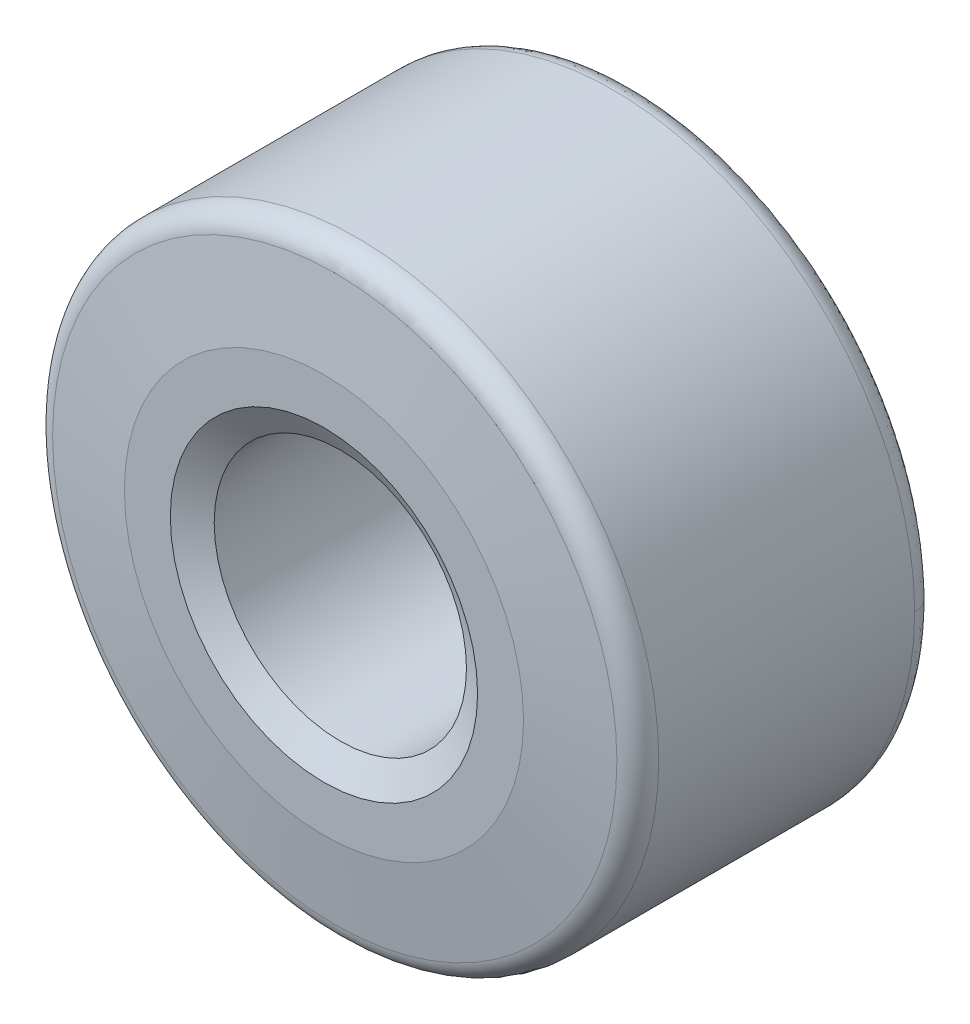
ISO-10303-21;
HEADER;
FILE_DESCRIPTION(('STEP AP214'),'2;1');
FILE_NAME('part.step','',(''),(''),'','','');
FILE_SCHEMA(('AUTOMOTIVE_DESIGN { 1 0 10303 214 1 1 1 1 }'));
ENDSEC;
DATA;
#1=APPLICATION_CONTEXT('core data for automotive mechanical design processes');
#2=APPLICATION_PROTOCOL_DEFINITION('international standard','automotive_design',2000,#1);
#3=PRODUCT_CONTEXT('',#1,'mechanical');
#4=PRODUCT('Part','Part','',(#3));
#5=PRODUCT_RELATED_PRODUCT_CATEGORY('part','',(#4));
#6=PRODUCT_DEFINITION_FORMATION('','',#4);
#7=PRODUCT_DEFINITION_CONTEXT('part definition',#1,'design');
#8=PRODUCT_DEFINITION('design','',#6,#7);
#9=PRODUCT_DEFINITION_SHAPE('','',#8);
#10=(LENGTH_UNIT() NAMED_UNIT(*) SI_UNIT(.MILLI.,.METRE.));
#11=(NAMED_UNIT(*) PLANE_ANGLE_UNIT() SI_UNIT($,.RADIAN.));
#12=(NAMED_UNIT(*) SI_UNIT($,.STERADIAN.) SOLID_ANGLE_UNIT());
#13=UNCERTAINTY_MEASURE_WITH_UNIT(LENGTH_MEASURE(1.E-05),#10,'distance_accuracy_value','');
#14=(GEOMETRIC_REPRESENTATION_CONTEXT(3) GLOBAL_UNCERTAINTY_ASSIGNED_CONTEXT((#13)) GLOBAL_UNIT_ASSIGNED_CONTEXT((#10,
#11,#12)) REPRESENTATION_CONTEXT('',''));
#15=CARTESIAN_POINT('',(0.,0.,0.));
#16=DIRECTION('',(0.,0.,1.));
#17=DIRECTION('',(1.,0.,0.));
#18=AXIS2_PLACEMENT_3D('',#15,#16,#17);
#19=CARTESIAN_POINT('',(117.,71.720826819,276.217998748));
#20=DIRECTION('',(0.,0.,-1.));
#21=DIRECTION('',(-1.,0.,0.));
#22=AXIS2_PLACEMENT_3D('',#19,#20,#21);
#23=CONICAL_SURFACE('',#22,28.07179677,1.05666839407383);
#24=CARTESIAN_POINT('',(117.,71.720826819,276.217998748));
#25=DIRECTION('',(0.,0.,-1.));
#26=DIRECTION('',(-1.,0.,0.));
#27=AXIS2_PLACEMENT_3D('',#24,#25,#26);
#28=CIRCLE('',#27,28.07179677);
#29=CARTESIAN_POINT('',(88.92820323,71.720826819,276.217998748));
#30=VERTEX_POINT('',#29);
#31=EDGE_CURVE('E73',#30,#30,#28,.T.);
#32=ORIENTED_EDGE('',*,*,#31,.F.);
#33=EDGE_LOOP('',(#32));
#34=FACE_BOUND('',#33,.T.);
#35=CARTESIAN_POINT('',(117.,71.720826819,272.757789575));
#36=DIRECTION('',(0.,0.,-1.));
#37=DIRECTION('',(-1.,0.,0.));
#38=AXIS2_PLACEMENT_3D('',#35,#36,#37);
#39=CIRCLE('',#38,34.1983294710002);
#40=CARTESIAN_POINT('',(82.8016705289998,71.720826819,272.757789575));
#41=VERTEX_POINT('',#40);
#42=EDGE_CURVE('E21',#41,#41,#39,.F.);
#43=ORIENTED_EDGE('',*,*,#42,.F.);
#44=EDGE_LOOP('',(#43));
#45=FACE_BOUND('',#44,.T.);
#46=ADVANCED_FACE('F17',(#34,#45),#23,.F.);
#47=CARTESIAN_POINT('',(161.949663623,26.771163195,272.757789575));
#48=DIRECTION('',(0.,0.,-1.));
#49=DIRECTION('',(-1.,0.,0.));
#50=AXIS2_PLACEMENT_3D('',#47,#48,#49);
#51=PLANE('',#50);
#52=ORIENTED_EDGE('',*,*,#42,.T.);
#53=EDGE_LOOP('',(#52));
#54=FACE_BOUND('',#53,.T.);
#55=CARTESIAN_POINT('',(117.,71.720826819,272.757789575));
#56=DIRECTION('',(0.,0.,1.));
#57=DIRECTION('',(1.,0.,0.));
#58=AXIS2_PLACEMENT_3D('',#55,#56,#57);
#59=CIRCLE('',#58,44.4166636589994);
#60=CARTESIAN_POINT('',(161.416663658999,71.720826819,272.757789575));
#61=VERTEX_POINT('',#60);
#62=EDGE_CURVE('E79',#61,#61,#59,.F.);
#63=ORIENTED_EDGE('',*,*,#62,.T.);
#64=EDGE_LOOP('',(#63));
#65=FACE_BOUND('',#64,.T.);
#66=ADVANCED_FACE('F191',(#54,#65),#51,.T.);
#67=CARTESIAN_POINT('',(117.,71.720826819,341.126186813));
#68=DIRECTION('',(0.,0.,-1.));
#69=DIRECTION('',(-1.,0.,0.));
#70=AXIS2_PLACEMENT_3D('',#67,#68,#69);
#71=CYLINDRICAL_SURFACE('',#70,28.07179677);
#72=CARTESIAN_POINT('',(117.,71.720826819,341.126186813));
#73=DIRECTION('',(0.,0.,1.));
#74=DIRECTION('',(1.,0.,0.));
#75=AXIS2_PLACEMENT_3D('',#72,#73,#74);
#76=CIRCLE('',#75,28.07179677);
#77=CARTESIAN_POINT('',(145.07179677,71.720826819,341.126186813));
#78=VERTEX_POINT('',#77);
#79=EDGE_CURVE('E54',#78,#78,#76,.F.);
#80=ORIENTED_EDGE('',*,*,#79,.F.);
#81=EDGE_LOOP('',(#80));
#82=FACE_BOUND('',#81,.T.);
#83=ORIENTED_EDGE('',*,*,#31,.T.);
#84=EDGE_LOOP('',(#83));
#85=FACE_BOUND('',#84,.T.);
#86=ADVANCED_FACE('F182',(#82,#85),#71,.F.);
#87=CARTESIAN_POINT('',(117.,71.720826819,272.757789575));
#88=DIRECTION('',(0.,0.,1.));
#89=DIRECTION('',(1.,0.,0.));
#90=AXIS2_PLACEMENT_3D('',#87,#88,#89);
#91=CONICAL_SURFACE('',#90,44.416663659,1.4229309625579);
#92=CARTESIAN_POINT('',(117.,71.720826819,275.507961254697));
#93=DIRECTION('',(0.,0.,1.));
#94=DIRECTION('',(1.,0.,0.));
#95=AXIS2_PLACEMENT_3D('',#92,#93,#94);
#96=CIRCLE('',#95,62.8800747072118);
#97=CARTESIAN_POINT('',(179.880074706411,71.7208268152358,275.507961254505));
#98=VERTEX_POINT('',#97);
#99=CARTESIAN_POINT('',(54.1199252951898,71.7208267932061,275.507961254121));
#100=VERTEX_POINT('',#99);
#101=EDGE_CURVE('E46',#98,#100,#96,.T.);
#102=ORIENTED_EDGE('',*,*,#101,.F.);
#103=CARTESIAN_POINT('',(117.,71.720826819,275.507961254697));
#104=DIRECTION('',(0.,0.,1.));
#105=DIRECTION('',(1.,0.,0.));
#106=AXIS2_PLACEMENT_3D('',#103,#104,#105);
#107=CIRCLE('',#106,62.8800747072118);
#108=EDGE_CURVE('E43',#100,#98,#107,.T.);
#109=ORIENTED_EDGE('',*,*,#108,.F.);
#110=EDGE_LOOP('',(#102,#109));
#111=FACE_BOUND('',#110,.T.);
#112=ORIENTED_EDGE('',*,*,#62,.F.);
#113=EDGE_LOOP('',(#112));
#114=FACE_BOUND('',#113,.T.);
#115=ADVANCED_FACE('F47',(#111,#114),#91,.T.);
#116=CARTESIAN_POINT('',(117.,71.720826819,341.126186813));
#117=DIRECTION('',(0.,0.,1.));
#118=DIRECTION('',(1.,0.,0.));
#119=AXIS2_PLACEMENT_3D('',#116,#117,#118);
#120=CONICAL_SURFACE('',#119,28.07179677,1.03390574508139);
#121=ORIENTED_EDGE('',*,*,#79,.T.);
#122=EDGE_LOOP('',(#121));
#123=FACE_BOUND('',#122,.T.);
#124=CARTESIAN_POINT('',(117.,71.720826819,344.77276519));
#125=DIRECTION('',(0.,0.,1.));
#126=DIRECTION('',(1.,0.,0.));
#127=AXIS2_PLACEMENT_3D('',#124,#125,#126);
#128=CIRCLE('',#127,34.1983294710001);
#129=CARTESIAN_POINT('',(151.198329471,71.720826819,344.77276519));
#130=VERTEX_POINT('',#129);
#131=EDGE_CURVE('E60',#130,#130,#128,.F.);
#132=ORIENTED_EDGE('',*,*,#131,.F.);
#133=EDGE_LOOP('',(#132));
#134=FACE_BOUND('',#133,.T.);
#135=ADVANCED_FACE('F165',(#123,#134),#120,.F.);
#136=CARTESIAN_POINT('',(49.881540108,71.720826819,280.952567442));
#137=CARTESIAN_POINT('',(49.881540108,-62.516092966,280.952567442));
#138=CARTESIAN_POINT('',(184.118459892,-62.516092966,280.952567442));
#139=CARTESIAN_POINT('',(184.118459892,71.720826819,280.952567442));
#140=CARTESIAN_POINT('',(49.576900876,71.720826819,277.916336547));
#141=CARTESIAN_POINT('',(49.576900876,-63.125371429,277.916336547));
#142=CARTESIAN_POINT('',(184.423099124,-63.125371429,277.916336547));
#143=CARTESIAN_POINT('',(184.423099124,71.720826819,277.916336547));
#144=CARTESIAN_POINT('',(51.569344866,71.720826819,275.605131221));
#145=CARTESIAN_POINT('',(51.569344866,-59.140483449,275.605131221));
#146=CARTESIAN_POINT('',(182.430655134,-59.140483449,275.605131221));
#147=CARTESIAN_POINT('',(182.430655134,71.720826819,275.605131221));
#148=CARTESIAN_POINT('',(54.617325489,71.720826819,275.459126998));
#149=CARTESIAN_POINT('',(54.617325489,-53.044522203,275.459126998));
#150=CARTESIAN_POINT('',(179.382674511,-53.044522203,275.459126998));
#151=CARTESIAN_POINT('',(179.382674511,71.720826819,275.459126998));
#152=(BOUNDED_SURFACE() B_SPLINE_SURFACE(3,3,((#136,#137,#138,#139),(#140,#141,#142,#143),(#144,
#145,#146,#147),(#148,#149,#150,#151)),.UNSPECIFIED.,.F.,.F.,
.F.) B_SPLINE_SURFACE_WITH_KNOTS((4,4),(4,4),(0.,1.),(0.,1.),
.UNSPECIFIED.) GEOMETRIC_REPRESENTATION_ITEM() RATIONAL_B_SPLINE_SURFACE(((1.,0.333333333333333,
0.333333333333333,1.),(0.792290842430709,0.264096947476903,0.264096947476903,0.792290842430709),
(0.792290842430709,0.264096947476903,0.264096947476903,0.792290842430709),(1.,0.333333333333333,
0.333333333333333,1.))) REPRESENTATION_ITEM('') SURFACE());
#153=CARTESIAN_POINT('',(184.118459892,71.720826819,280.952567442));
#154=CARTESIAN_POINT('',(184.423099124,71.720826819,277.916336547));
#155=CARTESIAN_POINT('',(182.430655134,71.720826819,275.605131221));
#156=CARTESIAN_POINT('',(179.382674511,71.720826819,275.459126998));
#157=(BOUNDED_CURVE() B_SPLINE_CURVE(3,(#153,#154,#155,#156),.UNSPECIFIED.,.F.,
.F.) B_SPLINE_CURVE_WITH_KNOTS((4,4),(0.,1.),
.UNSPECIFIED.) CURVE() GEOMETRIC_REPRESENTATION_ITEM() RATIONAL_B_SPLINE_CURVE((1.,
0.792290842430708,0.792290842430708,1.)) REPRESENTATION_ITEM(''));
#158=CARTESIAN_POINT('',(184.143439065793,71.7208268121143,280.453400356077));
#159=VERTEX_POINT('',#158);
#160=EDGE_CURVE('E36',#159,#98,#157,.T.);
#161=CARTESIAN_POINT('',(117.,71.720826819,280.453400359));
#162=DIRECTION('',(0.,0.,-1.));
#163=DIRECTION('',(-1.,0.,0.));
#164=AXIS2_PLACEMENT_3D('',#161,#162,#163);
#165=CIRCLE('',#164,67.143439066);
#166=CARTESIAN_POINT('',(49.8565609341726,71.7208268159855,280.453400356564));
#167=VERTEX_POINT('',#166);
#168=EDGE_CURVE('E63',#159,#167,#165,.T.);
#169=CARTESIAN_POINT('',(49.881540108,71.720826819,280.952567442));
#170=CARTESIAN_POINT('',(49.576900876,71.720826819,277.916336547));
#171=CARTESIAN_POINT('',(51.569344866,71.720826819,275.605131221));
#172=CARTESIAN_POINT('',(54.617325489,71.720826819,275.459126998));
#173=(BOUNDED_CURVE() B_SPLINE_CURVE(3,(#169,#170,#171,#172),.UNSPECIFIED.,.F.,
.F.) B_SPLINE_CURVE_WITH_KNOTS((4,4),(0.,1.),
.UNSPECIFIED.) CURVE() GEOMETRIC_REPRESENTATION_ITEM() RATIONAL_B_SPLINE_CURVE((1.,
0.792290842430708,0.792290842430708,1.)) REPRESENTATION_ITEM(''));
#174=EDGE_CURVE('E51',#100,#167,#173,.F.);
#175=ORIENTED_EDGE('',*,*,#160,.F.);
#176=ORIENTED_EDGE('',*,*,#168,.T.);
#177=ORIENTED_EDGE('',*,*,#174,.F.);
#178=ORIENTED_EDGE('',*,*,#108,.T.);
#179=EDGE_LOOP('',(#175,#176,#177,#178));
#180=FACE_BOUND('',#179,.T.);
#181=ADVANCED_FACE('F53',(#180),#152,.T.);
#182=CARTESIAN_POINT('',(184.118459892,71.720826819,280.952567442));
#183=CARTESIAN_POINT('',(184.118459892,205.957746603,280.952567442));
#184=CARTESIAN_POINT('',(49.881540108,205.957746603,280.952567442));
#185=CARTESIAN_POINT('',(49.881540108,71.720826819,280.952567442));
#186=CARTESIAN_POINT('',(184.423099124,71.720826819,277.916336547));
#187=CARTESIAN_POINT('',(184.423099124,206.567025066,277.916336547));
#188=CARTESIAN_POINT('',(49.576900876,206.567025066,277.916336547));
#189=CARTESIAN_POINT('',(49.576900876,71.720826819,277.916336547));
#190=CARTESIAN_POINT('',(182.430655134,71.720826819,275.605131221));
#191=CARTESIAN_POINT('',(182.430655134,202.582137086,275.605131221));
#192=CARTESIAN_POINT('',(51.569344866,202.582137086,275.605131221));
#193=CARTESIAN_POINT('',(51.569344866,71.720826819,275.605131221));
#194=CARTESIAN_POINT('',(179.382674511,71.720826819,275.459126998));
#195=CARTESIAN_POINT('',(179.382674511,196.486175841,275.459126998));
#196=CARTESIAN_POINT('',(54.617325489,196.486175841,275.459126998));
#197=CARTESIAN_POINT('',(54.617325489,71.720826819,275.459126998));
#198=(BOUNDED_SURFACE() B_SPLINE_SURFACE(3,3,((#182,#183,#184,#185),(#186,#187,#188,#189),(#190,
#191,#192,#193),(#194,#195,#196,#197)),.UNSPECIFIED.,.F.,.F.,
.F.) B_SPLINE_SURFACE_WITH_KNOTS((4,4),(4,4),(0.,1.),(0.,1.),
.UNSPECIFIED.) GEOMETRIC_REPRESENTATION_ITEM() RATIONAL_B_SPLINE_SURFACE(((1.,0.333333333333333,
0.333333333333333,1.),(0.792290842430708,0.264096947476903,0.264096947476903,0.792290842430708),
(0.792290842430708,0.264096947476903,0.264096947476903,0.792290842430708),(1.,0.333333333333333,
0.333333333333333,1.))) REPRESENTATION_ITEM('') SURFACE());
#199=CARTESIAN_POINT('',(117.,71.720826819,280.453400359));
#200=DIRECTION('',(0.,0.,-1.));
#201=DIRECTION('',(-1.,0.,0.));
#202=AXIS2_PLACEMENT_3D('',#199,#200,#201);
#203=CIRCLE('',#202,67.143439066);
#204=EDGE_CURVE('E58',#167,#159,#203,.T.);
#205=ORIENTED_EDGE('',*,*,#204,.T.);
#206=ORIENTED_EDGE('',*,*,#160,.T.);
#207=ORIENTED_EDGE('',*,*,#101,.T.);
#208=ORIENTED_EDGE('',*,*,#174,.T.);
#209=EDGE_LOOP('',(#205,#206,#207,#208));
#210=FACE_BOUND('',#209,.T.);
#211=ADVANCED_FACE('F56',(#210),#198,.T.);
#212=CARTESIAN_POINT('',(72.050336377,26.771163195,344.77276519));
#213=DIRECTION('',(0.,0.,1.));
#214=DIRECTION('',(1.,0.,0.));
#215=AXIS2_PLACEMENT_3D('',#212,#213,#214);
#216=PLANE('',#215);
#217=ORIENTED_EDGE('',*,*,#131,.T.);
#218=EDGE_LOOP('',(#217));
#219=FACE_BOUND('',#218,.T.);
#220=CARTESIAN_POINT('',(117.,71.720826819,344.77276519));
#221=DIRECTION('',(0.,0.,-1.));
#222=DIRECTION('',(0.,1.,0.));
#223=AXIS2_PLACEMENT_3D('',#220,#221,#222);
#224=CIRCLE('',#223,44.4166636589996);
#225=CARTESIAN_POINT('',(117.,116.137490478,344.77276519));
#226=VERTEX_POINT('',#225);
#227=EDGE_CURVE('E80',#226,#226,#224,.F.);
#228=ORIENTED_EDGE('',*,*,#227,.T.);
#229=EDGE_LOOP('',(#228));
#230=FACE_BOUND('',#229,.T.);
#231=ADVANCED_FACE('F108',(#219,#230),#216,.T.);
#232=CARTESIAN_POINT('',(117.,71.720826819,337.405669247));
#233=DIRECTION('',(0.,0.,-1.));
#234=DIRECTION('',(0.,1.,0.));
#235=AXIS2_PLACEMENT_3D('',#232,#233,#234);
#236=CYLINDRICAL_SURFACE('',#235,67.143439066);
#237=ORIENTED_EDGE('',*,*,#204,.F.);
#238=ORIENTED_EDGE('',*,*,#168,.F.);
#239=EDGE_LOOP('',(#237,#238));
#240=FACE_BOUND('',#239,.T.);
#241=CARTESIAN_POINT('',(117.,71.720826819,337.405669249386));
#242=DIRECTION('',(0.,0.,1.));
#243=DIRECTION('',(1.,0.,0.));
#244=AXIS2_PLACEMENT_3D('',#241,#242,#243);
#245=CIRCLE('',#244,67.1434390656671);
#246=CARTESIAN_POINT('',(184.143439065667,71.720826819,337.405669249386));
#247=VERTEX_POINT('',#246);
#248=EDGE_CURVE('E27',#247,#247,#245,.T.);
#249=ORIENTED_EDGE('',*,*,#248,.F.);
#250=EDGE_LOOP('',(#249));
#251=FACE_BOUND('',#250,.T.);
#252=ADVANCED_FACE('F105',(#240,#251),#236,.T.);
#253=CARTESIAN_POINT('',(117.,71.720826819,344.77276519));
#254=DIRECTION('',(0.,0.,-1.));
#255=DIRECTION('',(0.,1.,0.));
#256=AXIS2_PLACEMENT_3D('',#253,#254,#255);
#257=CONICAL_SURFACE('',#256,44.416663659,1.44042206392276);
#258=CARTESIAN_POINT('',(117.,71.720826819,342.363235782068));
#259=DIRECTION('',(0.,0.,-1.));
#260=DIRECTION('',(-1.,0.,0.));
#261=AXIS2_PLACEMENT_3D('',#258,#259,#260);
#262=CIRCLE('',#261,62.7934652599709);
#263=CARTESIAN_POINT('',(54.2065347400291,71.720826819,342.363235782068));
#264=VERTEX_POINT('',#263);
#265=EDGE_CURVE('E11',#264,#264,#262,.T.);
#266=ORIENTED_EDGE('',*,*,#265,.F.);
#267=EDGE_LOOP('',(#266));
#268=FACE_BOUND('',#267,.T.);
#269=ORIENTED_EDGE('',*,*,#227,.F.);
#270=EDGE_LOOP('',(#269));
#271=FACE_BOUND('',#270,.T.);
#272=ADVANCED_FACE('F107',(#268,#271),#257,.T.);
#273=CARTESIAN_POINT('',(117.,71.720826819,337.405669247897));
#274=DIRECTION('',(0.,0.,1.));
#275=DIRECTION('',(1.,0.,0.));
#276=AXIS2_PLACEMENT_3D('',#273,#274,#275);
#277=TOROIDAL_SURFACE('',#276,62.1434390655971,4.9999999997442);
#278=ORIENTED_EDGE('',*,*,#265,.T.);
#279=EDGE_LOOP('',(#278));
#280=FACE_BOUND('',#279,.T.);
#281=ORIENTED_EDGE('',*,*,#248,.T.);
#282=EDGE_LOOP('',(#281));
#283=FACE_BOUND('',#282,.T.);
#284=ADVANCED_FACE('F19',(#280,#283),#277,.T.);
#285=CLOSED_SHELL('',(#46,#66,#86,#115,#135,#181,#211,#231,#252,#272,#284));
#286=MANIFOLD_SOLID_BREP('B1',#285);
#287=ADVANCED_BREP_SHAPE_REPRESENTATION('',(#18,#286),#14);
#288=SHAPE_DEFINITION_REPRESENTATION(#9,#287);
ENDSEC;
END-ISO-10303-21;
